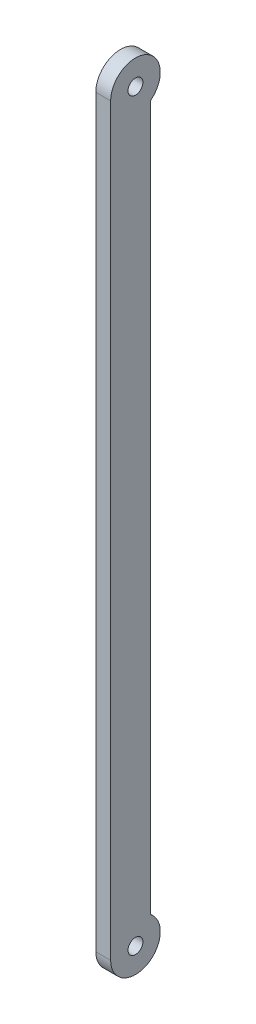
ISO-10303-21;
HEADER;
FILE_DESCRIPTION(('STEP AP214'),'2;1');
FILE_NAME('part.step','',(''),(''),'','','');
FILE_SCHEMA(('AUTOMOTIVE_DESIGN { 1 0 10303 214 1 1 1 1 }'));
ENDSEC;
DATA;
#1=APPLICATION_CONTEXT('core data for automotive mechanical design processes');
#2=APPLICATION_PROTOCOL_DEFINITION('international standard','automotive_design',2000,#1);
#3=PRODUCT_CONTEXT('',#1,'mechanical');
#4=PRODUCT('Part','Part','',(#3));
#5=PRODUCT_RELATED_PRODUCT_CATEGORY('part','',(#4));
#6=PRODUCT_DEFINITION_FORMATION('','',#4);
#7=PRODUCT_DEFINITION_CONTEXT('part definition',#1,'design');
#8=PRODUCT_DEFINITION('design','',#6,#7);
#9=PRODUCT_DEFINITION_SHAPE('','',#8);
#10=(LENGTH_UNIT() NAMED_UNIT(*) SI_UNIT(.MILLI.,.METRE.));
#11=(NAMED_UNIT(*) PLANE_ANGLE_UNIT() SI_UNIT($,.RADIAN.));
#12=(NAMED_UNIT(*) SI_UNIT($,.STERADIAN.) SOLID_ANGLE_UNIT());
#13=UNCERTAINTY_MEASURE_WITH_UNIT(LENGTH_MEASURE(1.E-05),#10,'distance_accuracy_value','');
#14=(GEOMETRIC_REPRESENTATION_CONTEXT(3) GLOBAL_UNCERTAINTY_ASSIGNED_CONTEXT((#13)) GLOBAL_UNIT_ASSIGNED_CONTEXT((#10,
#11,#12)) REPRESENTATION_CONTEXT('',''));
#15=CARTESIAN_POINT('',(0.,0.,0.));
#16=DIRECTION('',(0.,0.,1.));
#17=DIRECTION('',(1.,0.,0.));
#18=AXIS2_PLACEMENT_3D('',#15,#16,#17);
#19=CARTESIAN_POINT('',(3.,0.,0.));
#20=DIRECTION('',(1.,0.,0.));
#21=DIRECTION('',(0.,0.,-1.));
#22=AXIS2_PLACEMENT_3D('',#19,#20,#21);
#23=PLANE('',#22);
#24=CARTESIAN_POINT('',(3.,150.,0.));
#25=DIRECTION('',(1.,0.,0.));
#26=DIRECTION('',(0.,0.,-1.));
#27=AXIS2_PLACEMENT_3D('',#24,#25,#26);
#28=CIRCLE('',#27,1.5);
#29=CARTESIAN_POINT('',(3.,150.,-1.5));
#30=VERTEX_POINT('',#29);
#31=EDGE_CURVE('E99',#30,#30,#28,.T.);
#32=ORIENTED_EDGE('',*,*,#31,.F.);
#33=EDGE_LOOP('',(#32));
#34=FACE_BOUND('',#33,.T.);
#35=CARTESIAN_POINT('',(3.,0.,0.));
#36=DIRECTION('',(1.,0.,0.));
#37=DIRECTION('',(0.,0.,-1.));
#38=AXIS2_PLACEMENT_3D('',#35,#36,#37);
#39=CIRCLE('',#38,5.);
#40=CARTESIAN_POINT('',(3.,0.,5.));
#41=VERTEX_POINT('',#40);
#42=CARTESIAN_POINT('',(3.,3.99999999999998,-3.00000000000002));
#43=VERTEX_POINT('',#42);
#44=EDGE_CURVE('E84',#41,#43,#39,.T.);
#45=ORIENTED_EDGE('',*,*,#44,.T.);
#46=DIRECTION('',(0.,1.,0.));
#47=VECTOR('',#46,1.);
#48=CARTESIAN_POINT('',(3.,146.,-3.00000000000002));
#49=LINE('',#48,#47);
#50=CARTESIAN_POINT('',(3.,146.,-3.00000000000002));
#51=VERTEX_POINT('',#50);
#52=EDGE_CURVE('E79',#43,#51,#49,.T.);
#53=ORIENTED_EDGE('',*,*,#52,.T.);
#54=CARTESIAN_POINT('',(3.,150.,0.));
#55=DIRECTION('',(1.,0.,0.));
#56=DIRECTION('',(0.,0.,-1.));
#57=AXIS2_PLACEMENT_3D('',#54,#55,#56);
#58=CIRCLE('',#57,5.);
#59=CARTESIAN_POINT('',(3.,150.,5.));
#60=VERTEX_POINT('',#59);
#61=EDGE_CURVE('E82',#51,#60,#58,.T.);
#62=ORIENTED_EDGE('',*,*,#61,.T.);
#63=DIRECTION('',(0.,-1.,0.));
#64=VECTOR('',#63,1.);
#65=CARTESIAN_POINT('',(3.,150.,5.));
#66=LINE('',#65,#64);
#67=EDGE_CURVE('E49',#60,#41,#66,.T.);
#68=ORIENTED_EDGE('',*,*,#67,.T.);
#69=EDGE_LOOP('',(#45,#53,#62,#68));
#70=FACE_BOUND('',#69,.T.);
#71=CARTESIAN_POINT('',(3.,0.,0.));
#72=DIRECTION('',(1.,0.,0.));
#73=DIRECTION('',(0.,0.,-1.));
#74=AXIS2_PLACEMENT_3D('',#71,#72,#73);
#75=CIRCLE('',#74,1.5);
#76=CARTESIAN_POINT('',(3.,0.,-1.5));
#77=VERTEX_POINT('',#76);
#78=EDGE_CURVE('E114',#77,#77,#75,.T.);
#79=ORIENTED_EDGE('',*,*,#78,.F.);
#80=EDGE_LOOP('',(#79));
#81=FACE_BOUND('',#80,.T.);
#82=ADVANCED_FACE('F32',(#34,#70,#81),#23,.T.);
#83=CARTESIAN_POINT('',(0.,0.,0.));
#84=DIRECTION('',(1.,0.,0.));
#85=DIRECTION('',(0.,0.,-1.));
#86=AXIS2_PLACEMENT_3D('',#83,#84,#85);
#87=PLANE('',#86);
#88=CARTESIAN_POINT('',(0.,150.,0.));
#89=DIRECTION('',(1.,0.,0.));
#90=DIRECTION('',(0.,0.,-1.));
#91=AXIS2_PLACEMENT_3D('',#88,#89,#90);
#92=CIRCLE('',#91,1.5);
#93=CARTESIAN_POINT('',(0.,150.,-1.5));
#94=VERTEX_POINT('',#93);
#95=EDGE_CURVE('E111',#94,#94,#92,.T.);
#96=ORIENTED_EDGE('',*,*,#95,.T.);
#97=EDGE_LOOP('',(#96));
#98=FACE_BOUND('',#97,.T.);
#99=CARTESIAN_POINT('',(0.,0.,0.));
#100=DIRECTION('',(1.,0.,0.));
#101=DIRECTION('',(0.,0.,-1.));
#102=AXIS2_PLACEMENT_3D('',#99,#100,#101);
#103=CIRCLE('',#102,5.);
#104=CARTESIAN_POINT('',(0.,0.,5.));
#105=VERTEX_POINT('',#104);
#106=CARTESIAN_POINT('',(0.,3.99999999999998,-3.00000000000002));
#107=VERTEX_POINT('',#106);
#108=EDGE_CURVE('E96',#105,#107,#103,.T.);
#109=ORIENTED_EDGE('',*,*,#108,.F.);
#110=DIRECTION('',(0.,-1.,0.));
#111=VECTOR('',#110,1.);
#112=CARTESIAN_POINT('',(0.,150.,5.));
#113=LINE('',#112,#111);
#114=CARTESIAN_POINT('',(0.,150.,5.));
#115=VERTEX_POINT('',#114);
#116=EDGE_CURVE('E72',#115,#105,#113,.T.);
#117=ORIENTED_EDGE('',*,*,#116,.F.);
#118=CARTESIAN_POINT('',(0.,150.,0.));
#119=DIRECTION('',(1.,0.,0.));
#120=DIRECTION('',(0.,0.,-1.));
#121=AXIS2_PLACEMENT_3D('',#118,#119,#120);
#122=CIRCLE('',#121,5.);
#123=CARTESIAN_POINT('',(0.,146.,-3.00000000000002));
#124=VERTEX_POINT('',#123);
#125=EDGE_CURVE('E66',#124,#115,#122,.T.);
#126=ORIENTED_EDGE('',*,*,#125,.F.);
#127=DIRECTION('',(0.,1.,0.));
#128=VECTOR('',#127,1.);
#129=CARTESIAN_POINT('',(0.,146.,-3.00000000000002));
#130=LINE('',#129,#128);
#131=EDGE_CURVE('E88',#107,#124,#130,.T.);
#132=ORIENTED_EDGE('',*,*,#131,.F.);
#133=EDGE_LOOP('',(#109,#117,#126,#132));
#134=FACE_BOUND('',#133,.T.);
#135=CARTESIAN_POINT('',(0.,0.,0.));
#136=DIRECTION('',(1.,0.,0.));
#137=DIRECTION('',(0.,0.,-1.));
#138=AXIS2_PLACEMENT_3D('',#135,#136,#137);
#139=CIRCLE('',#138,1.5);
#140=CARTESIAN_POINT('',(0.,0.,-1.5));
#141=VERTEX_POINT('',#140);
#142=EDGE_CURVE('E117',#141,#141,#139,.T.);
#143=ORIENTED_EDGE('',*,*,#142,.T.);
#144=EDGE_LOOP('',(#143));
#145=FACE_BOUND('',#144,.T.);
#146=ADVANCED_FACE('F107',(#98,#134,#145),#87,.F.);
#147=CARTESIAN_POINT('',(3.,0.,0.));
#148=DIRECTION('',(-1.,0.,0.));
#149=DIRECTION('',(0.,0.,1.));
#150=AXIS2_PLACEMENT_3D('',#147,#148,#149);
#151=CYLINDRICAL_SURFACE('',#150,5.);
#152=ORIENTED_EDGE('',*,*,#108,.T.);
#153=DIRECTION('',(-1.,0.,0.));
#154=VECTOR('',#153,1.);
#155=CARTESIAN_POINT('',(3.,3.99999999999998,-3.00000000000002));
#156=LINE('',#155,#154);
#157=EDGE_CURVE('E11',#43,#107,#156,.T.);
#158=ORIENTED_EDGE('',*,*,#157,.F.);
#159=ORIENTED_EDGE('',*,*,#44,.F.);
#160=DIRECTION('',(-1.,0.,0.));
#161=VECTOR('',#160,1.);
#162=CARTESIAN_POINT('',(3.,0.,5.));
#163=LINE('',#162,#161);
#164=EDGE_CURVE('E92',#41,#105,#163,.T.);
#165=ORIENTED_EDGE('',*,*,#164,.T.);
#166=EDGE_LOOP('',(#152,#158,#159,#165));
#167=FACE_BOUND('',#166,.T.);
#168=ADVANCED_FACE('F34',(#167),#151,.T.);
#169=CARTESIAN_POINT('',(3.,146.,-3.00000000000002));
#170=DIRECTION('',(0.,0.,1.));
#171=DIRECTION('',(1.,0.,0.));
#172=AXIS2_PLACEMENT_3D('',#169,#170,#171);
#173=PLANE('',#172);
#174=ORIENTED_EDGE('',*,*,#131,.T.);
#175=DIRECTION('',(-1.,0.,0.));
#176=VECTOR('',#175,1.);
#177=CARTESIAN_POINT('',(3.,146.,-3.00000000000002));
#178=LINE('',#177,#176);
#179=EDGE_CURVE('E41',#51,#124,#178,.T.);
#180=ORIENTED_EDGE('',*,*,#179,.F.);
#181=ORIENTED_EDGE('',*,*,#52,.F.);
#182=ORIENTED_EDGE('',*,*,#157,.T.);
#183=EDGE_LOOP('',(#174,#180,#181,#182));
#184=FACE_BOUND('',#183,.T.);
#185=ADVANCED_FACE('F87',(#184),#173,.F.);
#186=CARTESIAN_POINT('',(3.,150.,0.));
#187=DIRECTION('',(-1.,0.,0.));
#188=DIRECTION('',(0.,0.,1.));
#189=AXIS2_PLACEMENT_3D('',#186,#187,#188);
#190=CYLINDRICAL_SURFACE('',#189,5.);
#191=ORIENTED_EDGE('',*,*,#125,.T.);
#192=DIRECTION('',(-1.,0.,0.));
#193=VECTOR('',#192,1.);
#194=CARTESIAN_POINT('',(3.,150.,5.));
#195=LINE('',#194,#193);
#196=EDGE_CURVE('E89',#60,#115,#195,.T.);
#197=ORIENTED_EDGE('',*,*,#196,.F.);
#198=ORIENTED_EDGE('',*,*,#61,.F.);
#199=ORIENTED_EDGE('',*,*,#179,.T.);
#200=EDGE_LOOP('',(#191,#197,#198,#199));
#201=FACE_BOUND('',#200,.T.);
#202=ADVANCED_FACE('F90',(#201),#190,.T.);
#203=CARTESIAN_POINT('',(3.,150.,5.));
#204=DIRECTION('',(0.,0.,-1.));
#205=DIRECTION('',(-1.,0.,0.));
#206=AXIS2_PLACEMENT_3D('',#203,#204,#205);
#207=PLANE('',#206);
#208=ORIENTED_EDGE('',*,*,#116,.T.);
#209=ORIENTED_EDGE('',*,*,#164,.F.);
#210=ORIENTED_EDGE('',*,*,#67,.F.);
#211=ORIENTED_EDGE('',*,*,#196,.T.);
#212=EDGE_LOOP('',(#208,#209,#210,#211));
#213=FACE_BOUND('',#212,.T.);
#214=ADVANCED_FACE('F104',(#213),#207,.F.);
#215=CARTESIAN_POINT('',(3.,150.,0.));
#216=DIRECTION('',(-1.,0.,0.));
#217=DIRECTION('',(0.,0.,1.));
#218=AXIS2_PLACEMENT_3D('',#215,#216,#217);
#219=CYLINDRICAL_SURFACE('',#218,1.5);
#220=ORIENTED_EDGE('',*,*,#31,.T.);
#221=EDGE_LOOP('',(#220));
#222=FACE_BOUND('',#221,.T.);
#223=ORIENTED_EDGE('',*,*,#95,.F.);
#224=EDGE_LOOP('',(#223));
#225=FACE_BOUND('',#224,.T.);
#226=ADVANCED_FACE('F135',(#222,#225),#219,.F.);
#227=CARTESIAN_POINT('',(3.,0.,0.));
#228=DIRECTION('',(-1.,0.,0.));
#229=DIRECTION('',(0.,0.,1.));
#230=AXIS2_PLACEMENT_3D('',#227,#228,#229);
#231=CYLINDRICAL_SURFACE('',#230,1.5);
#232=ORIENTED_EDGE('',*,*,#78,.T.);
#233=EDGE_LOOP('',(#232));
#234=FACE_BOUND('',#233,.T.);
#235=ORIENTED_EDGE('',*,*,#142,.F.);
#236=EDGE_LOOP('',(#235));
#237=FACE_BOUND('',#236,.T.);
#238=ADVANCED_FACE('F123',(#234,#237),#231,.F.);
#239=CLOSED_SHELL('',(#82,#146,#168,#185,#202,#214,#226,#238));
#240=MANIFOLD_SOLID_BREP('B2',#239);
#241=ADVANCED_BREP_SHAPE_REPRESENTATION('',(#18,#240),#14);
#242=SHAPE_DEFINITION_REPRESENTATION(#9,#241);
ENDSEC;
END-ISO-10303-21;
